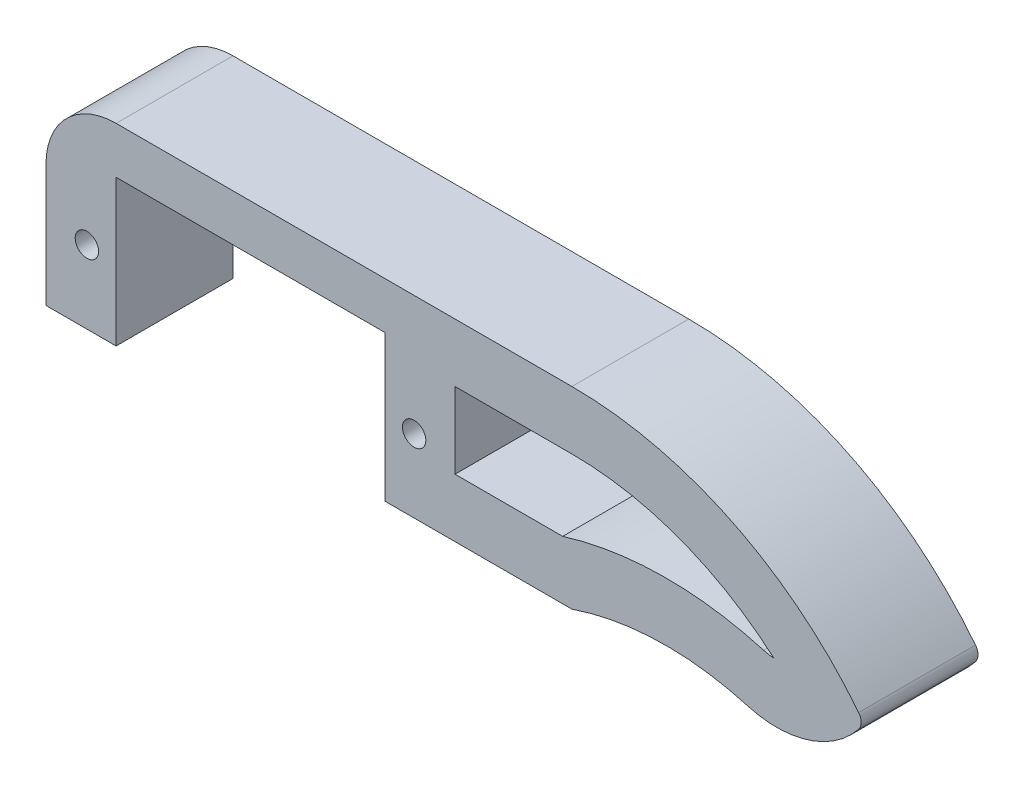
ISO-10303-21;
HEADER;
FILE_DESCRIPTION(('STEP AP214'),'2;1');
FILE_NAME('part.step','',(''),(''),'','','');
FILE_SCHEMA(('AUTOMOTIVE_DESIGN { 1 0 10303 214 1 1 1 1 }'));
ENDSEC;
DATA;
#1=APPLICATION_CONTEXT('core data for automotive mechanical design processes');
#2=APPLICATION_PROTOCOL_DEFINITION('international standard','automotive_design',2000,#1);
#3=PRODUCT_CONTEXT('',#1,'mechanical');
#4=PRODUCT('Part','Part','',(#3));
#5=PRODUCT_RELATED_PRODUCT_CATEGORY('part','',(#4));
#6=PRODUCT_DEFINITION_FORMATION('','',#4);
#7=PRODUCT_DEFINITION_CONTEXT('part definition',#1,'design');
#8=PRODUCT_DEFINITION('design','',#6,#7);
#9=PRODUCT_DEFINITION_SHAPE('','',#8);
#10=(LENGTH_UNIT() NAMED_UNIT(*) SI_UNIT(.MILLI.,.METRE.));
#11=(NAMED_UNIT(*) PLANE_ANGLE_UNIT() SI_UNIT($,.RADIAN.));
#12=(NAMED_UNIT(*) SI_UNIT($,.STERADIAN.) SOLID_ANGLE_UNIT());
#13=UNCERTAINTY_MEASURE_WITH_UNIT(LENGTH_MEASURE(1.E-05),#10,'distance_accuracy_value','');
#14=(GEOMETRIC_REPRESENTATION_CONTEXT(3) GLOBAL_UNCERTAINTY_ASSIGNED_CONTEXT((#13)) GLOBAL_UNIT_ASSIGNED_CONTEXT((#10,
#11,#12)) REPRESENTATION_CONTEXT('',''));
#15=CARTESIAN_POINT('',(0.,0.,0.));
#16=DIRECTION('',(0.,0.,1.));
#17=DIRECTION('',(1.,0.,0.));
#18=AXIS2_PLACEMENT_3D('',#15,#16,#17);
#19=CARTESIAN_POINT('',(29.,0.,-10.));
#20=DIRECTION('',(-1.,0.,0.));
#21=DIRECTION('',(0.,-1.,0.));
#22=AXIS2_PLACEMENT_3D('',#19,#20,#21);
#23=PLANE('',#22);
#24=DIRECTION('',(0.,-1.,0.));
#25=VECTOR('',#24,1.);
#26=CARTESIAN_POINT('',(29.,0.,0.));
#27=LINE('',#26,#25);
#28=CARTESIAN_POINT('',(29.,12.5,0.));
#29=VERTEX_POINT('',#28);
#30=CARTESIAN_POINT('',(29.,0.,0.));
#31=VERTEX_POINT('',#30);
#32=EDGE_CURVE('E214',#29,#31,#27,.T.);
#33=ORIENTED_EDGE('',*,*,#32,.F.);
#34=DIRECTION('',(0.,0.,1.));
#35=VECTOR('',#34,1.);
#36=CARTESIAN_POINT('',(29.,12.5,-10.));
#37=LINE('',#36,#35);
#38=CARTESIAN_POINT('',(29.,12.5,-10.));
#39=VERTEX_POINT('',#38);
#40=EDGE_CURVE('E235',#39,#29,#37,.T.);
#41=ORIENTED_EDGE('',*,*,#40,.F.);
#42=DIRECTION('',(0.,-1.,0.));
#43=VECTOR('',#42,1.);
#44=CARTESIAN_POINT('',(29.,0.,-10.));
#45=LINE('',#44,#43);
#46=CARTESIAN_POINT('',(29.,0.,-10.));
#47=VERTEX_POINT('',#46);
#48=EDGE_CURVE('E193',#39,#47,#45,.T.);
#49=ORIENTED_EDGE('',*,*,#48,.T.);
#50=DIRECTION('',(0.,0.,1.));
#51=VECTOR('',#50,1.);
#52=CARTESIAN_POINT('',(29.,0.,-10.));
#53=LINE('',#52,#51);
#54=EDGE_CURVE('E206',#47,#31,#53,.T.);
#55=ORIENTED_EDGE('',*,*,#54,.T.);
#56=EDGE_LOOP('',(#33,#41,#49,#55));
#57=FACE_BOUND('',#56,.T.);
#58=ADVANCED_FACE('F34',(#57),#23,.T.);
#59=CARTESIAN_POINT('',(0.,12.5,-10.));
#60=DIRECTION('',(0.,1.,0.));
#61=DIRECTION('',(0.,0.,1.));
#62=AXIS2_PLACEMENT_3D('',#59,#60,#61);
#63=PLANE('',#62);
#64=DIRECTION('',(-1.,0.,0.));
#65=VECTOR('',#64,1.);
#66=CARTESIAN_POINT('',(0.,12.5,0.));
#67=LINE('',#66,#65);
#68=CARTESIAN_POINT('',(6.,12.5,0.));
#69=VERTEX_POINT('',#68);
#70=EDGE_CURVE('E231',#29,#69,#67,.T.);
#71=ORIENTED_EDGE('',*,*,#70,.T.);
#72=DIRECTION('',(0.,0.,1.));
#73=VECTOR('',#72,1.);
#74=CARTESIAN_POINT('',(6.,12.5,-10.));
#75=LINE('',#74,#73);
#76=CARTESIAN_POINT('',(6.,12.5,-10.));
#77=VERTEX_POINT('',#76);
#78=EDGE_CURVE('E238',#77,#69,#75,.T.);
#79=ORIENTED_EDGE('',*,*,#78,.F.);
#80=DIRECTION('',(-1.,0.,0.));
#81=VECTOR('',#80,1.);
#82=CARTESIAN_POINT('',(0.,12.5,-10.));
#83=LINE('',#82,#81);
#84=EDGE_CURVE('E203',#39,#77,#83,.T.);
#85=ORIENTED_EDGE('',*,*,#84,.F.);
#86=ORIENTED_EDGE('',*,*,#40,.T.);
#87=EDGE_LOOP('',(#71,#79,#85,#86));
#88=FACE_BOUND('',#87,.T.);
#89=ADVANCED_FACE('F369',(#88),#63,.F.);
#90=CARTESIAN_POINT('',(6.,0.,-10.));
#91=DIRECTION('',(-1.,0.,0.));
#92=DIRECTION('',(0.,0.,1.));
#93=AXIS2_PLACEMENT_3D('',#90,#91,#92);
#94=PLANE('',#93);
#95=DIRECTION('',(0.,-1.,0.));
#96=VECTOR('',#95,1.);
#97=CARTESIAN_POINT('',(6.,0.,0.));
#98=LINE('',#97,#96);
#99=CARTESIAN_POINT('',(6.,0.,0.));
#100=VERTEX_POINT('',#99);
#101=EDGE_CURVE('E228',#69,#100,#98,.T.);
#102=ORIENTED_EDGE('',*,*,#101,.T.);
#103=DIRECTION('',(0.,0.,1.));
#104=VECTOR('',#103,1.);
#105=CARTESIAN_POINT('',(6.,0.,-10.));
#106=LINE('',#105,#104);
#107=CARTESIAN_POINT('',(6.,0.,-10.));
#108=VERTEX_POINT('',#107);
#109=EDGE_CURVE('E241',#108,#100,#106,.T.);
#110=ORIENTED_EDGE('',*,*,#109,.F.);
#111=DIRECTION('',(0.,-1.,0.));
#112=VECTOR('',#111,1.);
#113=CARTESIAN_POINT('',(6.,0.,-10.));
#114=LINE('',#113,#112);
#115=EDGE_CURVE('E201',#77,#108,#114,.T.);
#116=ORIENTED_EDGE('',*,*,#115,.F.);
#117=ORIENTED_EDGE('',*,*,#78,.T.);
#118=EDGE_LOOP('',(#102,#110,#116,#117));
#119=FACE_BOUND('',#118,.T.);
#120=ADVANCED_FACE('F374',(#119),#94,.F.);
#121=CARTESIAN_POINT('',(0.,0.,-10.));
#122=DIRECTION('',(0.,-1.,0.));
#123=DIRECTION('',(1.,0.,0.));
#124=AXIS2_PLACEMENT_3D('',#121,#122,#123);
#125=PLANE('',#124);
#126=DIRECTION('',(1.,0.,0.));
#127=VECTOR('',#126,1.);
#128=CARTESIAN_POINT('',(0.,0.,0.));
#129=LINE('',#128,#127);
#130=CARTESIAN_POINT('',(0.,0.,0.));
#131=VERTEX_POINT('',#130);
#132=EDGE_CURVE('E225',#131,#100,#129,.T.);
#133=ORIENTED_EDGE('',*,*,#132,.F.);
#134=DIRECTION('',(0.,0.,1.));
#135=VECTOR('',#134,1.);
#136=CARTESIAN_POINT('',(0.,0.,-10.));
#137=LINE('',#136,#135);
#138=CARTESIAN_POINT('',(0.,0.,-10.));
#139=VERTEX_POINT('',#138);
#140=EDGE_CURVE('E243',#139,#131,#137,.T.);
#141=ORIENTED_EDGE('',*,*,#140,.F.);
#142=DIRECTION('',(1.,0.,0.));
#143=VECTOR('',#142,1.);
#144=CARTESIAN_POINT('',(0.,0.,-10.));
#145=LINE('',#144,#143);
#146=EDGE_CURVE('E198',#139,#108,#145,.T.);
#147=ORIENTED_EDGE('',*,*,#146,.T.);
#148=ORIENTED_EDGE('',*,*,#109,.T.);
#149=EDGE_LOOP('',(#133,#141,#147,#148));
#150=FACE_BOUND('',#149,.T.);
#151=ADVANCED_FACE('F461',(#150),#125,.T.);
#152=CARTESIAN_POINT('',(0.,0.,-10.));
#153=DIRECTION('',(1.,0.,0.));
#154=DIRECTION('',(0.,0.,-1.));
#155=AXIS2_PLACEMENT_3D('',#152,#153,#154);
#156=PLANE('',#155);
#157=DIRECTION('',(0.,1.,0.));
#158=VECTOR('',#157,1.);
#159=CARTESIAN_POINT('',(0.,0.,0.));
#160=LINE('',#159,#158);
#161=CARTESIAN_POINT('',(0.,10.5,0.));
#162=VERTEX_POINT('',#161);
#163=EDGE_CURVE('E223',#131,#162,#160,.T.);
#164=ORIENTED_EDGE('',*,*,#163,.T.);
#165=DIRECTION('',(0.,0.,1.));
#166=VECTOR('',#165,1.);
#167=CARTESIAN_POINT('',(0.,10.5,-10.));
#168=LINE('',#167,#166);
#169=CARTESIAN_POINT('',(0.,10.5,-10.));
#170=VERTEX_POINT('',#169);
#171=EDGE_CURVE('E42',#162,#170,#168,.F.);
#172=ORIENTED_EDGE('',*,*,#171,.T.);
#173=DIRECTION('',(0.,1.,0.));
#174=VECTOR('',#173,1.);
#175=CARTESIAN_POINT('',(0.,0.,-10.));
#176=LINE('',#175,#174);
#177=EDGE_CURVE('E191',#139,#170,#176,.T.);
#178=ORIENTED_EDGE('',*,*,#177,.F.);
#179=ORIENTED_EDGE('',*,*,#140,.T.);
#180=EDGE_LOOP('',(#164,#172,#178,#179));
#181=FACE_BOUND('',#180,.T.);
#182=ADVANCED_FACE('F456',(#181),#156,.F.);
#183=CARTESIAN_POINT('',(0.,16.5,-10.));
#184=DIRECTION('',(0.,-1.,0.));
#185=DIRECTION('',(0.,0.,-1.));
#186=AXIS2_PLACEMENT_3D('',#183,#184,#185);
#187=PLANE('',#186);
#188=DIRECTION('',(1.,0.,0.));
#189=VECTOR('',#188,1.);
#190=CARTESIAN_POINT('',(0.,16.5,-10.));
#191=LINE('',#190,#189);
#192=CARTESIAN_POINT('',(6.,16.5,-10.));
#193=VERTEX_POINT('',#192);
#194=CARTESIAN_POINT('',(45.,16.5,-10.));
#195=VERTEX_POINT('',#194);
#196=EDGE_CURVE('E188',#193,#195,#191,.T.);
#197=ORIENTED_EDGE('',*,*,#196,.F.);
#198=DIRECTION('',(0.,0.,1.));
#199=VECTOR('',#198,1.);
#200=CARTESIAN_POINT('',(6.,16.5,-10.));
#201=LINE('',#200,#199);
#202=CARTESIAN_POINT('',(6.,16.5,0.));
#203=VERTEX_POINT('',#202);
#204=EDGE_CURVE('E254',#193,#203,#201,.T.);
#205=ORIENTED_EDGE('',*,*,#204,.T.);
#206=DIRECTION('',(1.,0.,0.));
#207=VECTOR('',#206,1.);
#208=CARTESIAN_POINT('',(0.,16.5,0.));
#209=LINE('',#208,#207);
#210=CARTESIAN_POINT('',(45.,16.5,0.));
#211=VERTEX_POINT('',#210);
#212=EDGE_CURVE('E221',#203,#211,#209,.T.);
#213=ORIENTED_EDGE('',*,*,#212,.T.);
#214=DIRECTION('',(0.,0.,1.));
#215=VECTOR('',#214,1.);
#216=CARTESIAN_POINT('',(45.,16.5,-10.));
#217=LINE('',#216,#215);
#218=EDGE_CURVE('E211',#195,#211,#217,.T.);
#219=ORIENTED_EDGE('',*,*,#218,.F.);
#220=EDGE_LOOP('',(#197,#205,#213,#219));
#221=FACE_BOUND('',#220,.T.);
#222=ADVANCED_FACE('F260',(#221),#187,.F.);
#223=CARTESIAN_POINT('',(35.,0.,-10.));
#224=DIRECTION('',(1.,0.,0.));
#225=DIRECTION('',(0.,0.,-1.));
#226=AXIS2_PLACEMENT_3D('',#223,#224,#225);
#227=PLANE('',#226);
#228=DIRECTION('',(0.,0.,1.));
#229=VECTOR('',#228,1.);
#230=CARTESIAN_POINT('',(35.,5.,-10.));
#231=LINE('',#230,#229);
#232=CARTESIAN_POINT('',(35.,5.,-10.));
#233=VERTEX_POINT('',#232);
#234=CARTESIAN_POINT('',(35.,5.,0.));
#235=VERTEX_POINT('',#234);
#236=EDGE_CURVE('E187',#233,#235,#231,.T.);
#237=ORIENTED_EDGE('',*,*,#236,.F.);
#238=DIRECTION('',(0.,1.,0.));
#239=VECTOR('',#238,1.);
#240=CARTESIAN_POINT('',(35.,0.,-10.));
#241=LINE('',#240,#239);
#242=CARTESIAN_POINT('',(35.,11.5,-10.));
#243=VERTEX_POINT('',#242);
#244=EDGE_CURVE('E178',#233,#243,#241,.T.);
#245=ORIENTED_EDGE('',*,*,#244,.T.);
#246=DIRECTION('',(0.,0.,1.));
#247=VECTOR('',#246,1.);
#248=CARTESIAN_POINT('',(35.,11.5,-10.));
#249=LINE('',#248,#247);
#250=CARTESIAN_POINT('',(35.,11.5,0.));
#251=VERTEX_POINT('',#250);
#252=EDGE_CURVE('E159',#243,#251,#249,.T.);
#253=ORIENTED_EDGE('',*,*,#252,.T.);
#254=DIRECTION('',(0.,1.,0.));
#255=VECTOR('',#254,1.);
#256=CARTESIAN_POINT('',(35.,0.,0.));
#257=LINE('',#256,#255);
#258=EDGE_CURVE('E219',#235,#251,#257,.T.);
#259=ORIENTED_EDGE('',*,*,#258,.F.);
#260=EDGE_LOOP('',(#237,#245,#253,#259));
#261=FACE_BOUND('',#260,.T.);
#262=ADVANCED_FACE('F185',(#261),#227,.T.);
#263=CARTESIAN_POINT('',(3.5,6.25,-10.));
#264=DIRECTION('',(0.,0.,1.));
#265=DIRECTION('',(1.,0.,0.));
#266=AXIS2_PLACEMENT_3D('',#263,#264,#265);
#267=CYLINDRICAL_SURFACE('',#266,0.999999999999999);
#268=CARTESIAN_POINT('',(3.5,6.25,-10.));
#269=DIRECTION('',(0.,0.,1.));
#270=DIRECTION('',(1.,0.,0.));
#271=AXIS2_PLACEMENT_3D('',#268,#269,#270);
#272=CIRCLE('',#271,0.999999999999999);
#273=CARTESIAN_POINT('',(4.5,6.25,-10.));
#274=VERTEX_POINT('',#273);
#275=EDGE_CURVE('E294',#274,#274,#272,.T.);
#276=ORIENTED_EDGE('',*,*,#275,.F.);
#277=EDGE_LOOP('',(#276));
#278=FACE_BOUND('',#277,.T.);
#279=CARTESIAN_POINT('',(3.5,6.25,0.));
#280=DIRECTION('',(0.,0.,1.));
#281=DIRECTION('',(1.,0.,0.));
#282=AXIS2_PLACEMENT_3D('',#279,#280,#281);
#283=CIRCLE('',#282,0.999999999999999);
#284=CARTESIAN_POINT('',(4.5,6.25,0.));
#285=VERTEX_POINT('',#284);
#286=EDGE_CURVE('E210',#285,#285,#283,.T.);
#287=ORIENTED_EDGE('',*,*,#286,.T.);
#288=EDGE_LOOP('',(#287));
#289=FACE_BOUND('',#288,.T.);
#290=ADVANCED_FACE('F380',(#278,#289),#267,.F.);
#291=CARTESIAN_POINT('',(31.5,6.25,-10.));
#292=DIRECTION('',(0.,0.,1.));
#293=DIRECTION('',(1.,0.,0.));
#294=AXIS2_PLACEMENT_3D('',#291,#292,#293);
#295=CYLINDRICAL_SURFACE('',#294,0.999999999999998);
#296=CARTESIAN_POINT('',(31.5,6.25,-10.));
#297=DIRECTION('',(0.,0.,1.));
#298=DIRECTION('',(1.,0.,0.));
#299=AXIS2_PLACEMENT_3D('',#296,#297,#298);
#300=CIRCLE('',#299,0.999999999999998);
#301=CARTESIAN_POINT('',(32.5,6.25,-10.));
#302=VERTEX_POINT('',#301);
#303=EDGE_CURVE('E234',#302,#302,#300,.T.);
#304=ORIENTED_EDGE('',*,*,#303,.F.);
#305=EDGE_LOOP('',(#304));
#306=FACE_BOUND('',#305,.T.);
#307=CARTESIAN_POINT('',(31.5,6.25,0.));
#308=DIRECTION('',(0.,0.,1.));
#309=DIRECTION('',(1.,0.,0.));
#310=AXIS2_PLACEMENT_3D('',#307,#308,#309);
#311=CIRCLE('',#310,0.999999999999998);
#312=CARTESIAN_POINT('',(32.5,6.25,0.));
#313=VERTEX_POINT('',#312);
#314=EDGE_CURVE('E207',#313,#313,#311,.T.);
#315=ORIENTED_EDGE('',*,*,#314,.T.);
#316=EDGE_LOOP('',(#315));
#317=FACE_BOUND('',#316,.T.);
#318=ADVANCED_FACE('F383',(#306,#317),#295,.F.);
#319=CARTESIAN_POINT('',(0.,0.,-10.));
#320=DIRECTION('',(0.,-1.,0.));
#321=DIRECTION('',(1.,0.,0.));
#322=AXIS2_PLACEMENT_3D('',#319,#320,#321);
#323=PLANE('',#322);
#324=DIRECTION('',(1.,0.,0.));
#325=VECTOR('',#324,1.);
#326=CARTESIAN_POINT('',(0.,0.,0.));
#327=LINE('',#326,#325);
#328=CARTESIAN_POINT('',(45.,0.,0.));
#329=VERTEX_POINT('',#328);
#330=EDGE_CURVE('E217',#31,#329,#327,.T.);
#331=ORIENTED_EDGE('',*,*,#330,.F.);
#332=ORIENTED_EDGE('',*,*,#54,.F.);
#333=DIRECTION('',(1.,0.,0.));
#334=VECTOR('',#333,1.);
#335=CARTESIAN_POINT('',(0.,0.,-10.));
#336=LINE('',#335,#334);
#337=CARTESIAN_POINT('',(45.,0.,-10.));
#338=VERTEX_POINT('',#337);
#339=EDGE_CURVE('E189',#47,#338,#336,.T.);
#340=ORIENTED_EDGE('',*,*,#339,.T.);
#341=DIRECTION('',(0.,0.,1.));
#342=VECTOR('',#341,1.);
#343=CARTESIAN_POINT('',(45.,0.,-10.));
#344=LINE('',#343,#342);
#345=EDGE_CURVE('E278',#338,#329,#344,.T.);
#346=ORIENTED_EDGE('',*,*,#345,.T.);
#347=EDGE_LOOP('',(#331,#332,#340,#346));
#348=FACE_BOUND('',#347,.T.);
#349=ADVANCED_FACE('F311',(#348),#323,.T.);
#350=CARTESIAN_POINT('',(0.,0.,-10.));
#351=DIRECTION('',(0.,0.,1.));
#352=DIRECTION('',(1.,0.,0.));
#353=AXIS2_PLACEMENT_3D('',#350,#351,#352);
#354=PLANE('',#353);
#355=DIRECTION('',(1.,0.,0.));
#356=VECTOR('',#355,1.);
#357=CARTESIAN_POINT('',(45.,11.5,-10.));
#358=LINE('',#357,#356);
#359=CARTESIAN_POINT('',(45.,11.5,-10.));
#360=VERTEX_POINT('',#359);
#361=EDGE_CURVE('E162',#243,#360,#358,.T.);
#362=ORIENTED_EDGE('',*,*,#361,.F.);
#363=ORIENTED_EDGE('',*,*,#244,.F.);
#364=DIRECTION('',(-1.,0.,0.));
#365=VECTOR('',#364,1.);
#366=CARTESIAN_POINT('',(44.2094571271556,5.,-10.));
#367=LINE('',#366,#365);
#368=CARTESIAN_POINT('',(44.2094571271556,5.,-10.));
#369=VERTEX_POINT('',#368);
#370=EDGE_CURVE('E337',#369,#233,#367,.T.);
#371=ORIENTED_EDGE('',*,*,#370,.F.);
#372=CARTESIAN_POINT('',(53.0706120955183,-23.6614712222988,-10.));
#373=DIRECTION('',(0.,0.,1.));
#374=DIRECTION('',(1.,0.,0.));
#375=AXIS2_PLACEMENT_3D('',#372,#373,#374);
#376=CIRCLE('',#375,30.);
#377=CARTESIAN_POINT('',(61.4053825051658,5.15747397384721,-10.));
#378=VERTEX_POINT('',#377);
#379=EDGE_CURVE('E339',#378,#369,#376,.T.);
#380=ORIENTED_EDGE('',*,*,#379,.F.);
#381=CARTESIAN_POINT('',(62.5166852264521,9.,-10.));
#382=DIRECTION('',(0.,0.,-1.));
#383=DIRECTION('',(-1.,0.,0.));
#384=AXIS2_PLACEMENT_3D('',#381,#382,#383);
#385=CIRCLE('',#384,4.);
#386=CARTESIAN_POINT('',(62.2838680731077,5.00678122649052,-10.));
#387=VERTEX_POINT('',#386);
#388=EDGE_CURVE('E342',#387,#378,#385,.T.);
#389=ORIENTED_EDGE('',*,*,#388,.F.);
#390=CARTESIAN_POINT('',(45.,-14.75,-10.));
#391=DIRECTION('',(0.,0.,-1.));
#392=DIRECTION('',(-1.,0.,0.));
#393=AXIS2_PLACEMENT_3D('',#390,#391,#392);
#394=CIRCLE('',#393,26.25);
#395=EDGE_CURVE('E181',#360,#387,#394,.T.);
#396=ORIENTED_EDGE('',*,*,#395,.F.);
#397=EDGE_LOOP('',(#362,#363,#371,#380,#389,#396));
#398=FACE_BOUND('',#397,.T.);
#399=ORIENTED_EDGE('',*,*,#303,.T.);
#400=EDGE_LOOP('',(#399));
#401=FACE_BOUND('',#400,.T.);
#402=ORIENTED_EDGE('',*,*,#275,.T.);
#403=EDGE_LOOP('',(#402));
#404=FACE_BOUND('',#403,.T.);
#405=ORIENTED_EDGE('',*,*,#177,.T.);
#406=CARTESIAN_POINT('',(6.,10.5,-10.));
#407=DIRECTION('',(0.,0.,1.));
#408=DIRECTION('',(1.,0.,0.));
#409=AXIS2_PLACEMENT_3D('',#406,#407,#408);
#410=CIRCLE('',#409,6.);
#411=EDGE_CURVE('E11',#170,#193,#410,.F.);
#412=ORIENTED_EDGE('',*,*,#411,.T.);
#413=ORIENTED_EDGE('',*,*,#196,.T.);
#414=CARTESIAN_POINT('',(45.,-14.75,-10.));
#415=DIRECTION('',(0.,0.,1.));
#416=DIRECTION('',(-1.,0.,0.));
#417=AXIS2_PLACEMENT_3D('',#414,#415,#416);
#418=CIRCLE('',#417,31.25);
#419=CARTESIAN_POINT('',(69.5349394223526,4.6045665810808,-10.));
#420=VERTEX_POINT('',#419);
#421=EDGE_CURVE('E170',#420,#195,#418,.T.);
#422=ORIENTED_EDGE('',*,*,#421,.F.);
#423=CARTESIAN_POINT('',(68.7498213608373,3.9852204504862,-10.));
#424=DIRECTION('',(0.,0.,1.));
#425=DIRECTION('',(1.,0.,0.));
#426=AXIS2_PLACEMENT_3D('',#423,#424,#425);
#427=CIRCLE('',#426,1.);
#428=CARTESIAN_POINT('',(69.5289633776354,3.35837300679698,-10.));
#429=VERTEX_POINT('',#428);
#430=EDGE_CURVE('E252',#420,#429,#427,.F.);
#431=ORIENTED_EDGE('',*,*,#430,.T.);
#432=CARTESIAN_POINT('',(62.5166852264521,9.,-10.));
#433=DIRECTION('',(0.,0.,1.));
#434=DIRECTION('',(-1.,0.,0.));
#435=AXIS2_PLACEMENT_3D('',#432,#433,#434);
#436=CIRCLE('',#435,9.);
#437=CARTESIAN_POINT('',(60.0162541035579,0.354316441156209,-10.));
#438=VERTEX_POINT('',#437);
#439=EDGE_CURVE('E333',#438,#429,#436,.T.);
#440=ORIENTED_EDGE('',*,*,#439,.F.);
#441=CARTESIAN_POINT('',(53.0706120955183,-23.6614712222988,-10.));
#442=DIRECTION('',(0.,0.,-1.));
#443=DIRECTION('',(1.,0.,0.));
#444=AXIS2_PLACEMENT_3D('',#441,#442,#443);
#445=CIRCLE('',#444,25.);
#446=EDGE_CURVE('E308',#338,#438,#445,.T.);
#447=ORIENTED_EDGE('',*,*,#446,.F.);
#448=ORIENTED_EDGE('',*,*,#339,.F.);
#449=ORIENTED_EDGE('',*,*,#48,.F.);
#450=ORIENTED_EDGE('',*,*,#84,.T.);
#451=ORIENTED_EDGE('',*,*,#115,.T.);
#452=ORIENTED_EDGE('',*,*,#146,.F.);
#453=EDGE_LOOP('',(#405,#412,#413,#422,#431,#440,#447,#448,#449,#450,#451,#452));
#454=FACE_BOUND('',#453,.T.);
#455=ADVANCED_FACE('F175',(#398,#401,#404,#454),#354,.F.);
#456=CARTESIAN_POINT('',(0.,0.,0.));
#457=DIRECTION('',(0.,0.,1.));
#458=DIRECTION('',(1.,0.,0.));
#459=AXIS2_PLACEMENT_3D('',#456,#457,#458);
#460=PLANE('',#459);
#461=ORIENTED_EDGE('',*,*,#258,.T.);
#462=DIRECTION('',(1.,0.,0.));
#463=VECTOR('',#462,1.);
#464=CARTESIAN_POINT('',(45.,11.5,0.));
#465=LINE('',#464,#463);
#466=CARTESIAN_POINT('',(45.,11.5,0.));
#467=VERTEX_POINT('',#466);
#468=EDGE_CURVE('E164',#251,#467,#465,.T.);
#469=ORIENTED_EDGE('',*,*,#468,.T.);
#470=CARTESIAN_POINT('',(45.,-14.75,0.));
#471=DIRECTION('',(0.,0.,-1.));
#472=DIRECTION('',(-1.,0.,0.));
#473=AXIS2_PLACEMENT_3D('',#470,#471,#472);
#474=CIRCLE('',#473,26.25);
#475=CARTESIAN_POINT('',(62.2838680731077,5.00678122649052,0.));
#476=VERTEX_POINT('',#475);
#477=EDGE_CURVE('E328',#467,#476,#474,.T.);
#478=ORIENTED_EDGE('',*,*,#477,.T.);
#479=CARTESIAN_POINT('',(62.5166852264521,9.,0.));
#480=DIRECTION('',(0.,0.,-1.));
#481=DIRECTION('',(-1.,0.,0.));
#482=AXIS2_PLACEMENT_3D('',#479,#480,#481);
#483=CIRCLE('',#482,4.);
#484=CARTESIAN_POINT('',(61.4053825051658,5.15747397384721,0.));
#485=VERTEX_POINT('',#484);
#486=EDGE_CURVE('E325',#476,#485,#483,.T.);
#487=ORIENTED_EDGE('',*,*,#486,.T.);
#488=CARTESIAN_POINT('',(53.0706120955183,-23.6614712222988,0.));
#489=DIRECTION('',(0.,0.,1.));
#490=DIRECTION('',(1.,0.,0.));
#491=AXIS2_PLACEMENT_3D('',#488,#489,#490);
#492=CIRCLE('',#491,30.);
#493=CARTESIAN_POINT('',(44.2094571271556,5.,0.));
#494=VERTEX_POINT('',#493);
#495=EDGE_CURVE('E320',#485,#494,#492,.T.);
#496=ORIENTED_EDGE('',*,*,#495,.T.);
#497=DIRECTION('',(-1.,0.,0.));
#498=VECTOR('',#497,1.);
#499=CARTESIAN_POINT('',(44.2094571271556,5.,0.));
#500=LINE('',#499,#498);
#501=EDGE_CURVE('E318',#494,#235,#500,.T.);
#502=ORIENTED_EDGE('',*,*,#501,.T.);
#503=EDGE_LOOP('',(#461,#469,#478,#487,#496,#502));
#504=FACE_BOUND('',#503,.T.);
#505=ORIENTED_EDGE('',*,*,#314,.F.);
#506=EDGE_LOOP('',(#505));
#507=FACE_BOUND('',#506,.T.);
#508=ORIENTED_EDGE('',*,*,#286,.F.);
#509=EDGE_LOOP('',(#508));
#510=FACE_BOUND('',#509,.T.);
#511=ORIENTED_EDGE('',*,*,#212,.F.);
#512=CARTESIAN_POINT('',(6.,10.5,0.));
#513=DIRECTION('',(0.,0.,1.));
#514=DIRECTION('',(1.,0.,0.));
#515=AXIS2_PLACEMENT_3D('',#512,#513,#514);
#516=CIRCLE('',#515,6.);
#517=EDGE_CURVE('E56',#203,#162,#516,.T.);
#518=ORIENTED_EDGE('',*,*,#517,.T.);
#519=ORIENTED_EDGE('',*,*,#163,.F.);
#520=ORIENTED_EDGE('',*,*,#132,.T.);
#521=ORIENTED_EDGE('',*,*,#101,.F.);
#522=ORIENTED_EDGE('',*,*,#70,.F.);
#523=ORIENTED_EDGE('',*,*,#32,.T.);
#524=ORIENTED_EDGE('',*,*,#330,.T.);
#525=CARTESIAN_POINT('',(53.0706120955183,-23.6614712222988,0.));
#526=DIRECTION('',(0.,0.,-1.));
#527=DIRECTION('',(1.,0.,0.));
#528=AXIS2_PLACEMENT_3D('',#525,#526,#527);
#529=CIRCLE('',#528,25.);
#530=CARTESIAN_POINT('',(60.0162541035579,0.354316441156209,0.));
#531=VERTEX_POINT('',#530);
#532=EDGE_CURVE('E316',#329,#531,#529,.T.);
#533=ORIENTED_EDGE('',*,*,#532,.T.);
#534=CARTESIAN_POINT('',(62.5166852264521,9.,0.));
#535=DIRECTION('',(0.,0.,1.));
#536=DIRECTION('',(-1.,0.,0.));
#537=AXIS2_PLACEMENT_3D('',#534,#535,#536);
#538=CIRCLE('',#537,9.);
#539=CARTESIAN_POINT('',(69.5289633776354,3.35837300679698,0.));
#540=VERTEX_POINT('',#539);
#541=EDGE_CURVE('E271',#531,#540,#538,.T.);
#542=ORIENTED_EDGE('',*,*,#541,.T.);
#543=CARTESIAN_POINT('',(68.7498213608373,3.9852204504862,0.));
#544=DIRECTION('',(0.,0.,1.));
#545=DIRECTION('',(1.,0.,0.));
#546=AXIS2_PLACEMENT_3D('',#543,#544,#545);
#547=CIRCLE('',#546,1.);
#548=CARTESIAN_POINT('',(69.5349394223526,4.6045665810808,0.));
#549=VERTEX_POINT('',#548);
#550=EDGE_CURVE('E248',#540,#549,#547,.T.);
#551=ORIENTED_EDGE('',*,*,#550,.T.);
#552=CARTESIAN_POINT('',(45.,-14.75,0.));
#553=DIRECTION('',(0.,0.,1.));
#554=DIRECTION('',(-1.,0.,0.));
#555=AXIS2_PLACEMENT_3D('',#552,#553,#554);
#556=CIRCLE('',#555,31.25);
#557=EDGE_CURVE('E182',#549,#211,#556,.T.);
#558=ORIENTED_EDGE('',*,*,#557,.T.);
#559=EDGE_LOOP('',(#511,#518,#519,#520,#521,#522,#523,#524,#533,#542,#551,#558));
#560=FACE_BOUND('',#559,.T.);
#561=ADVANCED_FACE('F265',(#504,#507,#510,#560),#460,.T.);
#562=CARTESIAN_POINT('',(45.,-14.75,-10.));
#563=DIRECTION('',(0.,0.,1.));
#564=DIRECTION('',(1.,0.,0.));
#565=AXIS2_PLACEMENT_3D('',#562,#563,#564);
#566=CYLINDRICAL_SURFACE('',#565,31.25);
#567=ORIENTED_EDGE('',*,*,#557,.F.);
#568=DIRECTION('',(0.,0.,1.));
#569=VECTOR('',#568,1.);
#570=CARTESIAN_POINT('',(69.5349394223526,4.6045665810808,-10.));
#571=LINE('',#570,#569);
#572=EDGE_CURVE('E250',#549,#420,#571,.F.);
#573=ORIENTED_EDGE('',*,*,#572,.T.);
#574=ORIENTED_EDGE('',*,*,#421,.T.);
#575=ORIENTED_EDGE('',*,*,#218,.T.);
#576=EDGE_LOOP('',(#567,#573,#574,#575));
#577=FACE_BOUND('',#576,.T.);
#578=ADVANCED_FACE('F274',(#577),#566,.T.);
#579=CARTESIAN_POINT('',(62.5166852264521,9.,-10.));
#580=DIRECTION('',(0.,0.,1.));
#581=DIRECTION('',(1.,0.,0.));
#582=AXIS2_PLACEMENT_3D('',#579,#580,#581);
#583=CYLINDRICAL_SURFACE('',#582,9.);
#584=ORIENTED_EDGE('',*,*,#439,.T.);
#585=DIRECTION('',(0.,0.,1.));
#586=VECTOR('',#585,1.);
#587=CARTESIAN_POINT('',(69.5289633776354,3.35837300679698,-10.));
#588=LINE('',#587,#586);
#589=EDGE_CURVE('E237',#429,#540,#588,.T.);
#590=ORIENTED_EDGE('',*,*,#589,.T.);
#591=ORIENTED_EDGE('',*,*,#541,.F.);
#592=DIRECTION('',(0.,0.,1.));
#593=VECTOR('',#592,1.);
#594=CARTESIAN_POINT('',(60.0162541035579,0.354316441156209,-10.));
#595=LINE('',#594,#593);
#596=EDGE_CURVE('E276',#438,#531,#595,.T.);
#597=ORIENTED_EDGE('',*,*,#596,.F.);
#598=EDGE_LOOP('',(#584,#590,#591,#597));
#599=FACE_BOUND('',#598,.T.);
#600=ADVANCED_FACE('F398',(#599),#583,.T.);
#601=CARTESIAN_POINT('',(53.0706120955183,-23.6614712222988,-10.));
#602=DIRECTION('',(0.,0.,1.));
#603=DIRECTION('',(1.,0.,0.));
#604=AXIS2_PLACEMENT_3D('',#601,#602,#603);
#605=CYLINDRICAL_SURFACE('',#604,25.);
#606=ORIENTED_EDGE('',*,*,#532,.F.);
#607=ORIENTED_EDGE('',*,*,#345,.F.);
#608=ORIENTED_EDGE('',*,*,#446,.T.);
#609=ORIENTED_EDGE('',*,*,#596,.T.);
#610=EDGE_LOOP('',(#606,#607,#608,#609));
#611=FACE_BOUND('',#610,.T.);
#612=ADVANCED_FACE('F314',(#611),#605,.F.);
#613=CARTESIAN_POINT('',(44.2094571271556,5.,-10.));
#614=DIRECTION('',(0.,1.,0.));
#615=DIRECTION('',(-1.,0.,0.));
#616=AXIS2_PLACEMENT_3D('',#613,#614,#615);
#617=PLANE('',#616);
#618=ORIENTED_EDGE('',*,*,#501,.F.);
#619=DIRECTION('',(0.,0.,1.));
#620=VECTOR('',#619,1.);
#621=CARTESIAN_POINT('',(44.2094571271556,5.,-10.));
#622=LINE('',#621,#620);
#623=EDGE_CURVE('E285',#369,#494,#622,.T.);
#624=ORIENTED_EDGE('',*,*,#623,.F.);
#625=ORIENTED_EDGE('',*,*,#370,.T.);
#626=ORIENTED_EDGE('',*,*,#236,.T.);
#627=EDGE_LOOP('',(#618,#624,#625,#626));
#628=FACE_BOUND('',#627,.T.);
#629=ADVANCED_FACE('F354',(#628),#617,.T.);
#630=CARTESIAN_POINT('',(53.0706120955183,-23.6614712222988,-10.));
#631=DIRECTION('',(0.,0.,1.));
#632=DIRECTION('',(1.,0.,0.));
#633=AXIS2_PLACEMENT_3D('',#630,#631,#632);
#634=CYLINDRICAL_SURFACE('',#633,30.);
#635=ORIENTED_EDGE('',*,*,#495,.F.);
#636=DIRECTION('',(0.,0.,1.));
#637=VECTOR('',#636,1.);
#638=CARTESIAN_POINT('',(61.4053825051658,5.15747397384721,-10.));
#639=LINE('',#638,#637);
#640=EDGE_CURVE('E287',#378,#485,#639,.T.);
#641=ORIENTED_EDGE('',*,*,#640,.F.);
#642=ORIENTED_EDGE('',*,*,#379,.T.);
#643=ORIENTED_EDGE('',*,*,#623,.T.);
#644=EDGE_LOOP('',(#635,#641,#642,#643));
#645=FACE_BOUND('',#644,.T.);
#646=ADVANCED_FACE('F357',(#645),#634,.T.);
#647=CARTESIAN_POINT('',(62.5166852264521,9.,-10.));
#648=DIRECTION('',(0.,0.,1.));
#649=DIRECTION('',(1.,0.,0.));
#650=AXIS2_PLACEMENT_3D('',#647,#648,#649);
#651=CYLINDRICAL_SURFACE('',#650,4.);
#652=ORIENTED_EDGE('',*,*,#486,.F.);
#653=DIRECTION('',(0.,0.,1.));
#654=VECTOR('',#653,1.);
#655=CARTESIAN_POINT('',(62.2838680731077,5.00678122649052,-10.));
#656=LINE('',#655,#654);
#657=EDGE_CURVE('E289',#387,#476,#656,.T.);
#658=ORIENTED_EDGE('',*,*,#657,.F.);
#659=ORIENTED_EDGE('',*,*,#388,.T.);
#660=ORIENTED_EDGE('',*,*,#640,.T.);
#661=EDGE_LOOP('',(#652,#658,#659,#660));
#662=FACE_BOUND('',#661,.T.);
#663=ADVANCED_FACE('F359',(#662),#651,.F.);
#664=CARTESIAN_POINT('',(45.,-14.75,-10.));
#665=DIRECTION('',(0.,0.,1.));
#666=DIRECTION('',(1.,0.,0.));
#667=AXIS2_PLACEMENT_3D('',#664,#665,#666);
#668=CYLINDRICAL_SURFACE('',#667,26.25);
#669=ORIENTED_EDGE('',*,*,#477,.F.);
#670=DIRECTION('',(0.,0.,1.));
#671=VECTOR('',#670,1.);
#672=CARTESIAN_POINT('',(45.,11.5,-10.));
#673=LINE('',#672,#671);
#674=EDGE_CURVE('E169',#360,#467,#673,.T.);
#675=ORIENTED_EDGE('',*,*,#674,.F.);
#676=ORIENTED_EDGE('',*,*,#395,.T.);
#677=ORIENTED_EDGE('',*,*,#657,.T.);
#678=EDGE_LOOP('',(#669,#675,#676,#677));
#679=FACE_BOUND('',#678,.T.);
#680=ADVANCED_FACE('F347',(#679),#668,.F.);
#681=CARTESIAN_POINT('',(45.,11.5,-10.));
#682=DIRECTION('',(0.,-1.,0.));
#683=DIRECTION('',(0.,0.,-1.));
#684=AXIS2_PLACEMENT_3D('',#681,#682,#683);
#685=PLANE('',#684);
#686=ORIENTED_EDGE('',*,*,#468,.F.);
#687=ORIENTED_EDGE('',*,*,#252,.F.);
#688=ORIENTED_EDGE('',*,*,#361,.T.);
#689=ORIENTED_EDGE('',*,*,#674,.T.);
#690=EDGE_LOOP('',(#686,#687,#688,#689));
#691=FACE_BOUND('',#690,.T.);
#692=ADVANCED_FACE('F161',(#691),#685,.T.);
#693=CARTESIAN_POINT('',(68.7498213608373,3.9852204504862,-10.));
#694=DIRECTION('',(0.,0.,1.));
#695=DIRECTION('',(1.,0.,0.));
#696=AXIS2_PLACEMENT_3D('',#693,#694,#695);
#697=CYLINDRICAL_SURFACE('',#696,1.);
#698=ORIENTED_EDGE('',*,*,#430,.F.);
#699=ORIENTED_EDGE('',*,*,#572,.F.);
#700=ORIENTED_EDGE('',*,*,#550,.F.);
#701=ORIENTED_EDGE('',*,*,#589,.F.);
#702=EDGE_LOOP('',(#698,#699,#700,#701));
#703=FACE_BOUND('',#702,.T.);
#704=ADVANCED_FACE('F387',(#703),#697,.T.);
#705=CARTESIAN_POINT('',(6.,10.5,-10.));
#706=DIRECTION('',(0.,0.,1.));
#707=DIRECTION('',(1.,0.,0.));
#708=AXIS2_PLACEMENT_3D('',#705,#706,#707);
#709=CYLINDRICAL_SURFACE('',#708,6.);
#710=ORIENTED_EDGE('',*,*,#411,.F.);
#711=ORIENTED_EDGE('',*,*,#171,.F.);
#712=ORIENTED_EDGE('',*,*,#517,.F.);
#713=ORIENTED_EDGE('',*,*,#204,.F.);
#714=EDGE_LOOP('',(#710,#711,#712,#713));
#715=FACE_BOUND('',#714,.T.);
#716=ADVANCED_FACE('F36',(#715),#709,.T.);
#717=CLOSED_SHELL('',(#58,#89,#120,#151,#182,#222,#262,#290,#318,#349,#455,#561,#578,#600,#612,
#629,#646,#663,#680,#692,#704,#716));
#718=MANIFOLD_SOLID_BREP('B2',#717);
#719=ADVANCED_BREP_SHAPE_REPRESENTATION('',(#18,#718),#14);
#720=SHAPE_DEFINITION_REPRESENTATION(#9,#719);
ENDSEC;
END-ISO-10303-21;
